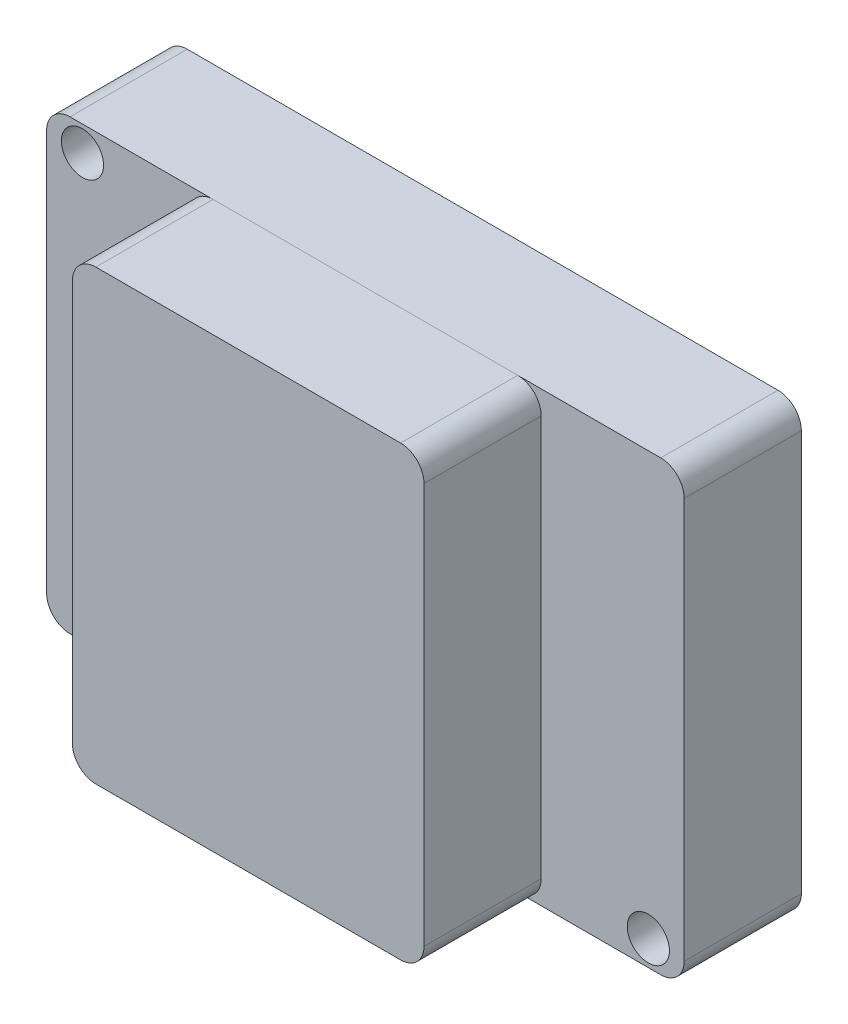
ISO-10303-21;
HEADER;
FILE_DESCRIPTION(('STEP AP214'),'2;1');
FILE_NAME('part.step','',(''),(''),'','','');
FILE_SCHEMA(('AUTOMOTIVE_DESIGN { 1 0 10303 214 1 1 1 1 }'));
ENDSEC;
DATA;
#1=APPLICATION_CONTEXT('core data for automotive mechanical design processes');
#2=APPLICATION_PROTOCOL_DEFINITION('international standard','automotive_design',2000,#1);
#3=PRODUCT_CONTEXT('',#1,'mechanical');
#4=PRODUCT('Part','Part','',(#3));
#5=PRODUCT_RELATED_PRODUCT_CATEGORY('part','',(#4));
#6=PRODUCT_DEFINITION_FORMATION('','',#4);
#7=PRODUCT_DEFINITION_CONTEXT('part definition',#1,'design');
#8=PRODUCT_DEFINITION('design','',#6,#7);
#9=PRODUCT_DEFINITION_SHAPE('','',#8);
#10=(LENGTH_UNIT() NAMED_UNIT(*) SI_UNIT(.MILLI.,.METRE.));
#11=(NAMED_UNIT(*) PLANE_ANGLE_UNIT() SI_UNIT($,.RADIAN.));
#12=(NAMED_UNIT(*) SI_UNIT($,.STERADIAN.) SOLID_ANGLE_UNIT());
#13=UNCERTAINTY_MEASURE_WITH_UNIT(LENGTH_MEASURE(1.E-05),#10,'distance_accuracy_value','');
#14=(GEOMETRIC_REPRESENTATION_CONTEXT(3) GLOBAL_UNCERTAINTY_ASSIGNED_CONTEXT((#13)) GLOBAL_UNIT_ASSIGNED_CONTEXT((#10,
#11,#12)) REPRESENTATION_CONTEXT('',''));
#15=CARTESIAN_POINT('',(0.,0.,0.));
#16=DIRECTION('',(0.,0.,1.));
#17=DIRECTION('',(1.,0.,0.));
#18=AXIS2_PLACEMENT_3D('',#15,#16,#17);
#19=CARTESIAN_POINT('',(19.05,-24.257,25.4));
#20=DIRECTION('',(-1.,0.,0.));
#21=DIRECTION('',(0.,0.,1.));
#22=AXIS2_PLACEMENT_3D('',#19,#20,#21);
#23=PLANE('',#22);
#24=DIRECTION('',(0.,1.,0.));
#25=VECTOR('',#24,1.);
#26=CARTESIAN_POINT('',(19.05,-24.257,12.7));
#27=LINE('',#26,#25);
#28=CARTESIAN_POINT('',(19.05,-21.717,12.7));
#29=VERTEX_POINT('',#28);
#30=CARTESIAN_POINT('',(19.05,21.717,12.7));
#31=VERTEX_POINT('',#30);
#32=EDGE_CURVE('E173',#29,#31,#27,.T.);
#33=ORIENTED_EDGE('',*,*,#32,.T.);
#34=DIRECTION('',(0.,0.,-1.));
#35=VECTOR('',#34,1.);
#36=CARTESIAN_POINT('',(19.05,21.717,25.4));
#37=LINE('',#36,#35);
#38=CARTESIAN_POINT('',(19.05,21.717,25.4));
#39=VERTEX_POINT('',#38);
#40=EDGE_CURVE('E12',#31,#39,#37,.F.);
#41=ORIENTED_EDGE('',*,*,#40,.T.);
#42=DIRECTION('',(0.,1.,0.));
#43=VECTOR('',#42,1.);
#44=CARTESIAN_POINT('',(19.05,-24.257,25.4));
#45=LINE('',#44,#43);
#46=CARTESIAN_POINT('',(19.05,-21.717,25.4));
#47=VERTEX_POINT('',#46);
#48=EDGE_CURVE('E141',#47,#39,#45,.T.);
#49=ORIENTED_EDGE('',*,*,#48,.F.);
#50=DIRECTION('',(0.,0.,-1.));
#51=VECTOR('',#50,1.);
#52=CARTESIAN_POINT('',(19.05,-21.717,25.4));
#53=LINE('',#52,#51);
#54=EDGE_CURVE('E57',#47,#29,#53,.T.);
#55=ORIENTED_EDGE('',*,*,#54,.T.);
#56=EDGE_LOOP('',(#33,#41,#49,#55));
#57=FACE_BOUND('',#56,.T.);
#58=ADVANCED_FACE('F49',(#57),#23,.F.);
#59=CARTESIAN_POINT('',(-19.05,24.257,25.4));
#60=DIRECTION('',(0.,-1.,0.));
#61=DIRECTION('',(0.,0.,-1.));
#62=AXIS2_PLACEMENT_3D('',#59,#60,#61);
#63=PLANE('',#62);
#64=DIRECTION('',(-1.,0.,0.));
#65=VECTOR('',#64,1.);
#66=CARTESIAN_POINT('',(-19.05,24.257,12.7));
#67=LINE('',#66,#65);
#68=CARTESIAN_POINT('',(16.51,24.257,12.7));
#69=VERTEX_POINT('',#68);
#70=CARTESIAN_POINT('',(-16.51,24.257,12.7));
#71=VERTEX_POINT('',#70);
#72=EDGE_CURVE('E146',#69,#71,#67,.T.);
#73=ORIENTED_EDGE('',*,*,#72,.T.);
#74=DIRECTION('',(0.,0.,-1.));
#75=VECTOR('',#74,1.);
#76=CARTESIAN_POINT('',(-16.51,24.257,25.4));
#77=LINE('',#76,#75);
#78=CARTESIAN_POINT('',(-16.51,24.257,25.4));
#79=VERTEX_POINT('',#78);
#80=EDGE_CURVE('E64',#71,#79,#77,.F.);
#81=ORIENTED_EDGE('',*,*,#80,.T.);
#82=DIRECTION('',(-1.,0.,0.));
#83=VECTOR('',#82,1.);
#84=CARTESIAN_POINT('',(-19.05,24.257,25.4));
#85=LINE('',#84,#83);
#86=CARTESIAN_POINT('',(16.51,24.257,25.4));
#87=VERTEX_POINT('',#86);
#88=EDGE_CURVE('E144',#87,#79,#85,.T.);
#89=ORIENTED_EDGE('',*,*,#88,.F.);
#90=DIRECTION('',(0.,0.,-1.));
#91=VECTOR('',#90,1.);
#92=CARTESIAN_POINT('',(16.51,24.257,25.4));
#93=LINE('',#92,#91);
#94=EDGE_CURVE('E165',#87,#69,#93,.T.);
#95=ORIENTED_EDGE('',*,*,#94,.T.);
#96=EDGE_LOOP('',(#73,#81,#89,#95));
#97=FACE_BOUND('',#96,.T.);
#98=ADVANCED_FACE('F193',(#97),#63,.F.);
#99=CARTESIAN_POINT('',(-19.05,-24.257,25.4));
#100=DIRECTION('',(1.,0.,0.));
#101=DIRECTION('',(0.,0.,-1.));
#102=AXIS2_PLACEMENT_3D('',#99,#100,#101);
#103=PLANE('',#102);
#104=DIRECTION('',(0.,-1.,0.));
#105=VECTOR('',#104,1.);
#106=CARTESIAN_POINT('',(-19.05,-24.257,12.7));
#107=LINE('',#106,#105);
#108=CARTESIAN_POINT('',(-19.05,21.717,12.7));
#109=VERTEX_POINT('',#108);
#110=CARTESIAN_POINT('',(-19.05,-21.717,12.7));
#111=VERTEX_POINT('',#110);
#112=EDGE_CURVE('E142',#109,#111,#107,.T.);
#113=ORIENTED_EDGE('',*,*,#112,.T.);
#114=DIRECTION('',(0.,0.,-1.));
#115=VECTOR('',#114,1.);
#116=CARTESIAN_POINT('',(-19.05,-21.717,25.4));
#117=LINE('',#116,#115);
#118=CARTESIAN_POINT('',(-19.05,-21.717,25.4));
#119=VERTEX_POINT('',#118);
#120=EDGE_CURVE('E120',#111,#119,#117,.F.);
#121=ORIENTED_EDGE('',*,*,#120,.T.);
#122=DIRECTION('',(0.,-1.,0.));
#123=VECTOR('',#122,1.);
#124=CARTESIAN_POINT('',(-19.05,-24.257,25.4));
#125=LINE('',#124,#123);
#126=CARTESIAN_POINT('',(-19.05,21.717,25.4));
#127=VERTEX_POINT('',#126);
#128=EDGE_CURVE('E181',#127,#119,#125,.T.);
#129=ORIENTED_EDGE('',*,*,#128,.F.);
#130=DIRECTION('',(0.,0.,-1.));
#131=VECTOR('',#130,1.);
#132=CARTESIAN_POINT('',(-19.05,21.717,25.4));
#133=LINE('',#132,#131);
#134=EDGE_CURVE('E125',#127,#109,#133,.T.);
#135=ORIENTED_EDGE('',*,*,#134,.T.);
#136=EDGE_LOOP('',(#113,#121,#129,#135));
#137=FACE_BOUND('',#136,.T.);
#138=ADVANCED_FACE('F192',(#137),#103,.F.);
#139=CARTESIAN_POINT('',(-19.05,-24.257,25.4));
#140=DIRECTION('',(0.,1.,0.));
#141=DIRECTION('',(0.,0.,1.));
#142=AXIS2_PLACEMENT_3D('',#139,#140,#141);
#143=PLANE('',#142);
#144=DIRECTION('',(1.,0.,0.));
#145=VECTOR('',#144,1.);
#146=CARTESIAN_POINT('',(-19.05,-24.257,25.4));
#147=LINE('',#146,#145);
#148=CARTESIAN_POINT('',(-16.51,-24.257,25.4));
#149=VERTEX_POINT('',#148);
#150=CARTESIAN_POINT('',(16.51,-24.257,25.4));
#151=VERTEX_POINT('',#150);
#152=EDGE_CURVE('E135',#149,#151,#147,.T.);
#153=ORIENTED_EDGE('',*,*,#152,.F.);
#154=DIRECTION('',(0.,0.,-1.));
#155=VECTOR('',#154,1.);
#156=CARTESIAN_POINT('',(-16.51,-24.257,25.4));
#157=LINE('',#156,#155);
#158=CARTESIAN_POINT('',(-16.51,-24.257,12.7));
#159=VERTEX_POINT('',#158);
#160=EDGE_CURVE('E119',#149,#159,#157,.T.);
#161=ORIENTED_EDGE('',*,*,#160,.T.);
#162=DIRECTION('',(1.,0.,0.));
#163=VECTOR('',#162,1.);
#164=CARTESIAN_POINT('',(-19.05,-24.257,12.7));
#165=LINE('',#164,#163);
#166=CARTESIAN_POINT('',(16.51,-24.257,12.7));
#167=VERTEX_POINT('',#166);
#168=EDGE_CURVE('E132',#159,#167,#165,.T.);
#169=ORIENTED_EDGE('',*,*,#168,.T.);
#170=DIRECTION('',(0.,0.,-1.));
#171=VECTOR('',#170,1.);
#172=CARTESIAN_POINT('',(16.51,-24.257,25.4));
#173=LINE('',#172,#171);
#174=EDGE_CURVE('E137',#167,#151,#173,.F.);
#175=ORIENTED_EDGE('',*,*,#174,.T.);
#176=EDGE_LOOP('',(#153,#161,#169,#175));
#177=FACE_BOUND('',#176,.T.);
#178=ADVANCED_FACE('F131',(#177),#143,.F.);
#179=CARTESIAN_POINT('',(0.,0.,25.4));
#180=DIRECTION('',(0.,0.,-1.));
#181=DIRECTION('',(-1.,0.,0.));
#182=AXIS2_PLACEMENT_3D('',#179,#180,#181);
#183=PLANE('',#182);
#184=ORIENTED_EDGE('',*,*,#128,.T.);
#185=CARTESIAN_POINT('',(-16.51,-21.717,25.4));
#186=DIRECTION('',(0.,0.,-1.));
#187=DIRECTION('',(-1.,0.,0.));
#188=AXIS2_PLACEMENT_3D('',#185,#186,#187);
#189=CIRCLE('',#188,2.54);
#190=EDGE_CURVE('E163',#119,#149,#189,.F.);
#191=ORIENTED_EDGE('',*,*,#190,.T.);
#192=ORIENTED_EDGE('',*,*,#152,.T.);
#193=CARTESIAN_POINT('',(16.51,-21.717,25.4));
#194=DIRECTION('',(0.,0.,-1.));
#195=DIRECTION('',(-1.,0.,0.));
#196=AXIS2_PLACEMENT_3D('',#193,#194,#195);
#197=CIRCLE('',#196,2.54);
#198=EDGE_CURVE('E158',#151,#47,#197,.F.);
#199=ORIENTED_EDGE('',*,*,#198,.T.);
#200=ORIENTED_EDGE('',*,*,#48,.T.);
#201=CARTESIAN_POINT('',(16.51,21.717,25.4));
#202=DIRECTION('',(0.,0.,-1.));
#203=DIRECTION('',(-1.,0.,0.));
#204=AXIS2_PLACEMENT_3D('',#201,#202,#203);
#205=CIRCLE('',#204,2.54);
#206=EDGE_CURVE('E71',#39,#87,#205,.F.);
#207=ORIENTED_EDGE('',*,*,#206,.T.);
#208=ORIENTED_EDGE('',*,*,#88,.T.);
#209=CARTESIAN_POINT('',(-16.51,21.717,25.4));
#210=DIRECTION('',(0.,0.,-1.));
#211=DIRECTION('',(-1.,0.,0.));
#212=AXIS2_PLACEMENT_3D('',#209,#210,#211);
#213=CIRCLE('',#212,2.54);
#214=EDGE_CURVE('E161',#79,#127,#213,.F.);
#215=ORIENTED_EDGE('',*,*,#214,.T.);
#216=EDGE_LOOP('',(#184,#191,#192,#199,#200,#207,#208,#215));
#217=FACE_BOUND('',#216,.T.);
#218=ADVANCED_FACE('F185',(#217),#183,.F.);
#219=CARTESIAN_POINT('',(0.,0.,12.7));
#220=DIRECTION('',(0.,0.,-1.));
#221=DIRECTION('',(-1.,0.,0.));
#222=AXIS2_PLACEMENT_3D('',#219,#220,#221);
#223=PLANE('',#222);
#224=ORIENTED_EDGE('',*,*,#168,.F.);
#225=CARTESIAN_POINT('',(-16.51,-21.717,12.7));
#226=DIRECTION('',(0.,0.,-1.));
#227=DIRECTION('',(-1.,0.,0.));
#228=AXIS2_PLACEMENT_3D('',#225,#226,#227);
#229=CIRCLE('',#228,2.54);
#230=EDGE_CURVE('E115',#159,#111,#229,.T.);
#231=ORIENTED_EDGE('',*,*,#230,.T.);
#232=ORIENTED_EDGE('',*,*,#112,.F.);
#233=CARTESIAN_POINT('',(-16.51,21.717,12.7));
#234=DIRECTION('',(0.,0.,-1.));
#235=DIRECTION('',(-1.,0.,0.));
#236=AXIS2_PLACEMENT_3D('',#233,#234,#235);
#237=CIRCLE('',#236,2.54);
#238=EDGE_CURVE('E126',#109,#71,#237,.T.);
#239=ORIENTED_EDGE('',*,*,#238,.T.);
#240=ORIENTED_EDGE('',*,*,#72,.F.);
#241=CARTESIAN_POINT('',(16.51,21.717,12.7));
#242=DIRECTION('',(0.,0.,-1.));
#243=DIRECTION('',(-1.,0.,0.));
#244=AXIS2_PLACEMENT_3D('',#241,#242,#243);
#245=CIRCLE('',#244,2.54);
#246=EDGE_CURVE('E152',#69,#31,#245,.T.);
#247=ORIENTED_EDGE('',*,*,#246,.T.);
#248=ORIENTED_EDGE('',*,*,#32,.F.);
#249=CARTESIAN_POINT('',(16.51,-21.717,12.7));
#250=DIRECTION('',(0.,0.,-1.));
#251=DIRECTION('',(-1.,0.,0.));
#252=AXIS2_PLACEMENT_3D('',#249,#250,#251);
#253=CIRCLE('',#252,2.54);
#254=EDGE_CURVE('E136',#29,#167,#253,.T.);
#255=ORIENTED_EDGE('',*,*,#254,.T.);
#256=EDGE_LOOP('',(#224,#231,#232,#239,#240,#247,#248,#255));
#257=FACE_BOUND('',#256,.T.);
#258=ADVANCED_FACE('F139',(#257),#223,.T.);
#259=CARTESIAN_POINT('',(-16.51,-21.717,25.4));
#260=DIRECTION('',(0.,0.,-1.));
#261=DIRECTION('',(-1.,0.,0.));
#262=AXIS2_PLACEMENT_3D('',#259,#260,#261);
#263=CYLINDRICAL_SURFACE('',#262,2.54);
#264=ORIENTED_EDGE('',*,*,#190,.F.);
#265=ORIENTED_EDGE('',*,*,#120,.F.);
#266=ORIENTED_EDGE('',*,*,#230,.F.);
#267=ORIENTED_EDGE('',*,*,#160,.F.);
#268=EDGE_LOOP('',(#264,#265,#266,#267));
#269=FACE_BOUND('',#268,.T.);
#270=ADVANCED_FACE('F118',(#269),#263,.T.);
#271=CARTESIAN_POINT('',(-16.51,21.717,25.4));
#272=DIRECTION('',(0.,0.,-1.));
#273=DIRECTION('',(-1.,0.,0.));
#274=AXIS2_PLACEMENT_3D('',#271,#272,#273);
#275=CYLINDRICAL_SURFACE('',#274,2.54);
#276=ORIENTED_EDGE('',*,*,#214,.F.);
#277=ORIENTED_EDGE('',*,*,#80,.F.);
#278=ORIENTED_EDGE('',*,*,#238,.F.);
#279=ORIENTED_EDGE('',*,*,#134,.F.);
#280=EDGE_LOOP('',(#276,#277,#278,#279));
#281=FACE_BOUND('',#280,.T.);
#282=ADVANCED_FACE('F190',(#281),#275,.T.);
#283=CARTESIAN_POINT('',(16.51,21.717,25.4));
#284=DIRECTION('',(0.,0.,-1.));
#285=DIRECTION('',(-1.,0.,0.));
#286=AXIS2_PLACEMENT_3D('',#283,#284,#285);
#287=CYLINDRICAL_SURFACE('',#286,2.54);
#288=ORIENTED_EDGE('',*,*,#206,.F.);
#289=ORIENTED_EDGE('',*,*,#40,.F.);
#290=ORIENTED_EDGE('',*,*,#246,.F.);
#291=ORIENTED_EDGE('',*,*,#94,.F.);
#292=EDGE_LOOP('',(#288,#289,#290,#291));
#293=FACE_BOUND('',#292,.T.);
#294=ADVANCED_FACE('F195',(#293),#287,.T.);
#295=CARTESIAN_POINT('',(16.51,-21.717,25.4));
#296=DIRECTION('',(0.,0.,-1.));
#297=DIRECTION('',(-1.,0.,0.));
#298=AXIS2_PLACEMENT_3D('',#295,#296,#297);
#299=CYLINDRICAL_SURFACE('',#298,2.54);
#300=ORIENTED_EDGE('',*,*,#198,.F.);
#301=ORIENTED_EDGE('',*,*,#174,.F.);
#302=ORIENTED_EDGE('',*,*,#254,.F.);
#303=ORIENTED_EDGE('',*,*,#54,.F.);
#304=EDGE_LOOP('',(#300,#301,#302,#303));
#305=FACE_BOUND('',#304,.T.);
#306=ADVANCED_FACE('F51',(#305),#299,.T.);
#307=CLOSED_SHELL('',(#58,#98,#138,#178,#218,#258,#270,#282,#294,#306));
#308=MANIFOLD_SOLID_BREP('B2',#307);
#309=CARTESIAN_POINT('',(0.,0.,12.7));
#310=DIRECTION('',(0.,0.,-1.));
#311=DIRECTION('',(-1.,0.,0.));
#312=AXIS2_PLACEMENT_3D('',#309,#310,#311);
#313=PLANE('',#312);
#314=DIRECTION('',(-1.,0.,0.));
#315=VECTOR('',#314,1.);
#316=CARTESIAN_POINT('',(-34.544,24.257,12.7));
#317=LINE('',#316,#315);
#318=CARTESIAN_POINT('',(32.004,24.257,12.7));
#319=VERTEX_POINT('',#318);
#320=CARTESIAN_POINT('',(-32.004,24.257,12.7));
#321=VERTEX_POINT('',#320);
#322=EDGE_CURVE('E433',#319,#321,#317,.T.);
#323=ORIENTED_EDGE('',*,*,#322,.T.);
#324=CARTESIAN_POINT('',(-32.004,21.717,12.7));
#325=DIRECTION('',(0.,0.,-1.));
#326=DIRECTION('',(-1.,0.,0.));
#327=AXIS2_PLACEMENT_3D('',#324,#325,#326);
#328=CIRCLE('',#327,2.54);
#329=CARTESIAN_POINT('',(-34.544,21.717,12.7));
#330=VERTEX_POINT('',#329);
#331=EDGE_CURVE('E406',#321,#330,#328,.F.);
#332=ORIENTED_EDGE('',*,*,#331,.T.);
#333=DIRECTION('',(0.,-1.,0.));
#334=VECTOR('',#333,1.);
#335=CARTESIAN_POINT('',(-34.544,-24.257,12.7));
#336=LINE('',#335,#334);
#337=CARTESIAN_POINT('',(-34.544,-21.717,12.7));
#338=VERTEX_POINT('',#337);
#339=EDGE_CURVE('E363',#330,#338,#336,.T.);
#340=ORIENTED_EDGE('',*,*,#339,.T.);
#341=CARTESIAN_POINT('',(-32.004,-21.717,12.7));
#342=DIRECTION('',(0.,0.,-1.));
#343=DIRECTION('',(-1.,0.,0.));
#344=AXIS2_PLACEMENT_3D('',#341,#342,#343);
#345=CIRCLE('',#344,2.54);
#346=CARTESIAN_POINT('',(-32.004,-24.257,12.7));
#347=VERTEX_POINT('',#346);
#348=EDGE_CURVE('E298',#338,#347,#345,.F.);
#349=ORIENTED_EDGE('',*,*,#348,.T.);
#350=DIRECTION('',(1.,0.,0.));
#351=VECTOR('',#350,1.);
#352=CARTESIAN_POINT('',(-34.544,-24.257,12.7));
#353=LINE('',#352,#351);
#354=CARTESIAN_POINT('',(32.004,-24.257,12.7));
#355=VERTEX_POINT('',#354);
#356=EDGE_CURVE('E384',#347,#355,#353,.T.);
#357=ORIENTED_EDGE('',*,*,#356,.T.);
#358=CARTESIAN_POINT('',(32.004,-21.717,12.7));
#359=DIRECTION('',(0.,0.,-1.));
#360=DIRECTION('',(-1.,0.,0.));
#361=AXIS2_PLACEMENT_3D('',#358,#359,#360);
#362=CIRCLE('',#361,2.54);
#363=CARTESIAN_POINT('',(34.544,-21.717,12.7));
#364=VERTEX_POINT('',#363);
#365=EDGE_CURVE('E400',#355,#364,#362,.F.);
#366=ORIENTED_EDGE('',*,*,#365,.T.);
#367=DIRECTION('',(0.,1.,0.));
#368=VECTOR('',#367,1.);
#369=CARTESIAN_POINT('',(34.544,-24.257,12.7));
#370=LINE('',#369,#368);
#371=CARTESIAN_POINT('',(34.544,21.717,12.7));
#372=VERTEX_POINT('',#371);
#373=EDGE_CURVE('E377',#364,#372,#370,.T.);
#374=ORIENTED_EDGE('',*,*,#373,.T.);
#375=CARTESIAN_POINT('',(32.004,21.717,12.7));
#376=DIRECTION('',(0.,0.,-1.));
#377=DIRECTION('',(-1.,0.,0.));
#378=AXIS2_PLACEMENT_3D('',#375,#376,#377);
#379=CIRCLE('',#378,2.54);
#380=EDGE_CURVE('E403',#372,#319,#379,.F.);
#381=ORIENTED_EDGE('',*,*,#380,.T.);
#382=EDGE_LOOP('',(#323,#332,#340,#349,#357,#366,#374,#381));
#383=FACE_BOUND('',#382,.T.);
#384=CARTESIAN_POINT('',(-30.6607160060067,21.5301351365709,12.7));
#385=DIRECTION('',(0.,0.,1.));
#386=DIRECTION('',(1.,0.,0.));
#387=AXIS2_PLACEMENT_3D('',#384,#385,#386);
#388=CIRCLE('',#387,2.286);
#389=CARTESIAN_POINT('',(-28.3747160060067,21.5301351365709,12.7));
#390=VERTEX_POINT('',#389);
#391=EDGE_CURVE('E446',#390,#390,#388,.T.);
#392=ORIENTED_EDGE('',*,*,#391,.F.);
#393=EDGE_LOOP('',(#392));
#394=FACE_BOUND('',#393,.T.);
#395=CARTESIAN_POINT('',(30.6607160060067,-21.5301351365709,12.7));
#396=DIRECTION('',(0.,0.,1.));
#397=DIRECTION('',(1.,0.,0.));
#398=AXIS2_PLACEMENT_3D('',#395,#396,#397);
#399=CIRCLE('',#398,2.286);
#400=CARTESIAN_POINT('',(32.9467160060067,-21.5301351365709,12.7));
#401=VERTEX_POINT('',#400);
#402=EDGE_CURVE('E453',#401,#401,#399,.T.);
#403=ORIENTED_EDGE('',*,*,#402,.F.);
#404=EDGE_LOOP('',(#403));
#405=FACE_BOUND('',#404,.T.);
#406=ADVANCED_FACE('F277',(#383,#394,#405),#313,.F.);
#407=CARTESIAN_POINT('',(0.,0.,0.));
#408=DIRECTION('',(0.,0.,-1.));
#409=DIRECTION('',(-1.,0.,0.));
#410=AXIS2_PLACEMENT_3D('',#407,#408,#409);
#411=PLANE('',#410);
#412=CARTESIAN_POINT('',(-30.6607160060067,21.5301351365709,0.));
#413=DIRECTION('',(0.,0.,1.));
#414=DIRECTION('',(1.,0.,0.));
#415=AXIS2_PLACEMENT_3D('',#412,#413,#414);
#416=CIRCLE('',#415,2.286);
#417=CARTESIAN_POINT('',(-28.3747160060067,21.5301351365709,0.));
#418=VERTEX_POINT('',#417);
#419=EDGE_CURVE('E439',#418,#418,#416,.T.);
#420=ORIENTED_EDGE('',*,*,#419,.T.);
#421=EDGE_LOOP('',(#420));
#422=FACE_BOUND('',#421,.T.);
#423=DIRECTION('',(0.,-1.,0.));
#424=VECTOR('',#423,1.);
#425=CARTESIAN_POINT('',(-34.544,-24.257,0.));
#426=LINE('',#425,#424);
#427=CARTESIAN_POINT('',(-34.544,21.717,0.));
#428=VERTEX_POINT('',#427);
#429=CARTESIAN_POINT('',(-34.544,-21.717,0.));
#430=VERTEX_POINT('',#429);
#431=EDGE_CURVE('E361',#428,#430,#426,.T.);
#432=ORIENTED_EDGE('',*,*,#431,.F.);
#433=CARTESIAN_POINT('',(-32.004,21.717,0.));
#434=DIRECTION('',(0.,0.,-1.));
#435=DIRECTION('',(-1.,0.,0.));
#436=AXIS2_PLACEMENT_3D('',#433,#434,#435);
#437=CIRCLE('',#436,2.54);
#438=CARTESIAN_POINT('',(-32.004,24.257,0.));
#439=VERTEX_POINT('',#438);
#440=EDGE_CURVE('E343',#428,#439,#437,.T.);
#441=ORIENTED_EDGE('',*,*,#440,.T.);
#442=DIRECTION('',(-1.,0.,0.));
#443=VECTOR('',#442,1.);
#444=CARTESIAN_POINT('',(-34.544,24.257,0.));
#445=LINE('',#444,#443);
#446=CARTESIAN_POINT('',(32.004,24.257,0.));
#447=VERTEX_POINT('',#446);
#448=EDGE_CURVE('E373',#447,#439,#445,.T.);
#449=ORIENTED_EDGE('',*,*,#448,.F.);
#450=CARTESIAN_POINT('',(32.004,21.717,0.));
#451=DIRECTION('',(0.,0.,-1.));
#452=DIRECTION('',(-1.,0.,0.));
#453=AXIS2_PLACEMENT_3D('',#450,#451,#452);
#454=CIRCLE('',#453,2.54);
#455=CARTESIAN_POINT('',(34.544,21.717,0.));
#456=VERTEX_POINT('',#455);
#457=EDGE_CURVE('E355',#447,#456,#454,.T.);
#458=ORIENTED_EDGE('',*,*,#457,.T.);
#459=DIRECTION('',(0.,1.,0.));
#460=VECTOR('',#459,1.);
#461=CARTESIAN_POINT('',(34.544,-24.257,0.));
#462=LINE('',#461,#460);
#463=CARTESIAN_POINT('',(34.544,-21.717,0.));
#464=VERTEX_POINT('',#463);
#465=EDGE_CURVE('E379',#464,#456,#462,.T.);
#466=ORIENTED_EDGE('',*,*,#465,.F.);
#467=CARTESIAN_POINT('',(32.004,-21.717,0.));
#468=DIRECTION('',(0.,0.,-1.));
#469=DIRECTION('',(-1.,0.,0.));
#470=AXIS2_PLACEMENT_3D('',#467,#468,#469);
#471=CIRCLE('',#470,2.54);
#472=CARTESIAN_POINT('',(32.004,-24.257,0.));
#473=VERTEX_POINT('',#472);
#474=EDGE_CURVE('E388',#464,#473,#471,.T.);
#475=ORIENTED_EDGE('',*,*,#474,.T.);
#476=DIRECTION('',(1.,0.,0.));
#477=VECTOR('',#476,1.);
#478=CARTESIAN_POINT('',(-34.544,-24.257,0.));
#479=LINE('',#478,#477);
#480=CARTESIAN_POINT('',(-32.004,-24.257,0.));
#481=VERTEX_POINT('',#480);
#482=EDGE_CURVE('E372',#481,#473,#479,.T.);
#483=ORIENTED_EDGE('',*,*,#482,.F.);
#484=CARTESIAN_POINT('',(-32.004,-21.717,0.));
#485=DIRECTION('',(0.,0.,-1.));
#486=DIRECTION('',(-1.,0.,0.));
#487=AXIS2_PLACEMENT_3D('',#484,#485,#486);
#488=CIRCLE('',#487,2.54);
#489=EDGE_CURVE('E365',#481,#430,#488,.T.);
#490=ORIENTED_EDGE('',*,*,#489,.T.);
#491=EDGE_LOOP('',(#432,#441,#449,#458,#466,#475,#483,#490));
#492=FACE_BOUND('',#491,.T.);
#493=CARTESIAN_POINT('',(30.6607160060067,-21.5301351365709,0.));
#494=DIRECTION('',(0.,0.,1.));
#495=DIRECTION('',(1.,0.,0.));
#496=AXIS2_PLACEMENT_3D('',#493,#494,#495);
#497=CIRCLE('',#496,2.286);
#498=CARTESIAN_POINT('',(32.9467160060067,-21.5301351365709,0.));
#499=VERTEX_POINT('',#498);
#500=EDGE_CURVE('E455',#499,#499,#497,.T.);
#501=ORIENTED_EDGE('',*,*,#500,.T.);
#502=EDGE_LOOP('',(#501));
#503=FACE_BOUND('',#502,.T.);
#504=ADVANCED_FACE('F368',(#422,#492,#503),#411,.T.);
#505=CARTESIAN_POINT('',(34.544,-24.257,12.7));
#506=DIRECTION('',(-1.,0.,0.));
#507=DIRECTION('',(0.,0.,1.));
#508=AXIS2_PLACEMENT_3D('',#505,#506,#507);
#509=PLANE('',#508);
#510=ORIENTED_EDGE('',*,*,#465,.T.);
#511=DIRECTION('',(0.,0.,-1.));
#512=VECTOR('',#511,1.);
#513=CARTESIAN_POINT('',(34.544,21.717,12.7));
#514=LINE('',#513,#512);
#515=EDGE_CURVE('E413',#456,#372,#514,.F.);
#516=ORIENTED_EDGE('',*,*,#515,.T.);
#517=ORIENTED_EDGE('',*,*,#373,.F.);
#518=DIRECTION('',(0.,0.,-1.));
#519=VECTOR('',#518,1.);
#520=CARTESIAN_POINT('',(34.544,-21.717,12.7));
#521=LINE('',#520,#519);
#522=EDGE_CURVE('E409',#364,#464,#521,.T.);
#523=ORIENTED_EDGE('',*,*,#522,.T.);
#524=EDGE_LOOP('',(#510,#516,#517,#523));
#525=FACE_BOUND('',#524,.T.);
#526=ADVANCED_FACE('F428',(#525),#509,.F.);
#527=CARTESIAN_POINT('',(-34.544,24.257,12.7));
#528=DIRECTION('',(0.,-1.,0.));
#529=DIRECTION('',(0.,0.,-1.));
#530=AXIS2_PLACEMENT_3D('',#527,#528,#529);
#531=PLANE('',#530);
#532=ORIENTED_EDGE('',*,*,#448,.T.);
#533=DIRECTION('',(0.,0.,-1.));
#534=VECTOR('',#533,1.);
#535=CARTESIAN_POINT('',(-32.004,24.257,12.7));
#536=LINE('',#535,#534);
#537=EDGE_CURVE('E348',#439,#321,#536,.F.);
#538=ORIENTED_EDGE('',*,*,#537,.T.);
#539=ORIENTED_EDGE('',*,*,#322,.F.);
#540=DIRECTION('',(0.,0.,-1.));
#541=VECTOR('',#540,1.);
#542=CARTESIAN_POINT('',(32.004,24.257,12.7));
#543=LINE('',#542,#541);
#544=EDGE_CURVE('E354',#319,#447,#543,.T.);
#545=ORIENTED_EDGE('',*,*,#544,.T.);
#546=EDGE_LOOP('',(#532,#538,#539,#545));
#547=FACE_BOUND('',#546,.T.);
#548=ADVANCED_FACE('F482',(#547),#531,.F.);
#549=CARTESIAN_POINT('',(-34.544,-24.257,12.7));
#550=DIRECTION('',(1.,0.,0.));
#551=DIRECTION('',(0.,0.,-1.));
#552=AXIS2_PLACEMENT_3D('',#549,#550,#551);
#553=PLANE('',#552);
#554=ORIENTED_EDGE('',*,*,#339,.F.);
#555=DIRECTION('',(0.,0.,-1.));
#556=VECTOR('',#555,1.);
#557=CARTESIAN_POINT('',(-34.544,21.717,12.7));
#558=LINE('',#557,#556);
#559=EDGE_CURVE('E347',#330,#428,#558,.T.);
#560=ORIENTED_EDGE('',*,*,#559,.T.);
#561=ORIENTED_EDGE('',*,*,#431,.T.);
#562=DIRECTION('',(0.,0.,-1.));
#563=VECTOR('',#562,1.);
#564=CARTESIAN_POINT('',(-34.544,-21.717,12.7));
#565=LINE('',#564,#563);
#566=EDGE_CURVE('E366',#430,#338,#565,.F.);
#567=ORIENTED_EDGE('',*,*,#566,.T.);
#568=EDGE_LOOP('',(#554,#560,#561,#567));
#569=FACE_BOUND('',#568,.T.);
#570=ADVANCED_FACE('F360',(#569),#553,.F.);
#571=CARTESIAN_POINT('',(-34.544,-24.257,12.7));
#572=DIRECTION('',(0.,1.,0.));
#573=DIRECTION('',(0.,0.,1.));
#574=AXIS2_PLACEMENT_3D('',#571,#572,#573);
#575=PLANE('',#574);
#576=ORIENTED_EDGE('',*,*,#482,.T.);
#577=DIRECTION('',(0.,0.,-1.));
#578=VECTOR('',#577,1.);
#579=CARTESIAN_POINT('',(32.004,-24.257,12.7));
#580=LINE('',#579,#578);
#581=EDGE_CURVE('E47',#473,#355,#580,.F.);
#582=ORIENTED_EDGE('',*,*,#581,.T.);
#583=ORIENTED_EDGE('',*,*,#356,.F.);
#584=DIRECTION('',(0.,0.,-1.));
#585=VECTOR('',#584,1.);
#586=CARTESIAN_POINT('',(-32.004,-24.257,12.7));
#587=LINE('',#586,#585);
#588=EDGE_CURVE('E286',#347,#481,#587,.T.);
#589=ORIENTED_EDGE('',*,*,#588,.T.);
#590=EDGE_LOOP('',(#576,#582,#583,#589));
#591=FACE_BOUND('',#590,.T.);
#592=ADVANCED_FACE('F418',(#591),#575,.F.);
#593=CARTESIAN_POINT('',(-30.6607160060067,21.5301351365709,12.7));
#594=DIRECTION('',(0.,0.,-1.));
#595=DIRECTION('',(-1.,0.,0.));
#596=AXIS2_PLACEMENT_3D('',#593,#594,#595);
#597=CYLINDRICAL_SURFACE('',#596,2.286);
#598=ORIENTED_EDGE('',*,*,#391,.T.);
#599=EDGE_LOOP('',(#598));
#600=FACE_BOUND('',#599,.T.);
#601=ORIENTED_EDGE('',*,*,#419,.F.);
#602=EDGE_LOOP('',(#601));
#603=FACE_BOUND('',#602,.T.);
#604=ADVANCED_FACE('F475',(#600,#603),#597,.F.);
#605=CARTESIAN_POINT('',(30.6607160060067,-21.5301351365709,12.7));
#606=DIRECTION('',(0.,0.,-1.));
#607=DIRECTION('',(-1.,0.,0.));
#608=AXIS2_PLACEMENT_3D('',#605,#606,#607);
#609=CYLINDRICAL_SURFACE('',#608,2.286);
#610=ORIENTED_EDGE('',*,*,#402,.T.);
#611=EDGE_LOOP('',(#610));
#612=FACE_BOUND('',#611,.T.);
#613=ORIENTED_EDGE('',*,*,#500,.F.);
#614=EDGE_LOOP('',(#613));
#615=FACE_BOUND('',#614,.T.);
#616=ADVANCED_FACE('F463',(#612,#615),#609,.F.);
#617=CARTESIAN_POINT('',(-32.004,21.717,12.7));
#618=DIRECTION('',(0.,0.,-1.));
#619=DIRECTION('',(-1.,0.,0.));
#620=AXIS2_PLACEMENT_3D('',#617,#618,#619);
#621=CYLINDRICAL_SURFACE('',#620,2.54);
#622=ORIENTED_EDGE('',*,*,#331,.F.);
#623=ORIENTED_EDGE('',*,*,#537,.F.);
#624=ORIENTED_EDGE('',*,*,#440,.F.);
#625=ORIENTED_EDGE('',*,*,#559,.F.);
#626=EDGE_LOOP('',(#622,#623,#624,#625));
#627=FACE_BOUND('',#626,.T.);
#628=ADVANCED_FACE('F346',(#627),#621,.T.);
#629=CARTESIAN_POINT('',(32.004,21.717,12.7));
#630=DIRECTION('',(0.,0.,-1.));
#631=DIRECTION('',(-1.,0.,0.));
#632=AXIS2_PLACEMENT_3D('',#629,#630,#631);
#633=CYLINDRICAL_SURFACE('',#632,2.54);
#634=ORIENTED_EDGE('',*,*,#380,.F.);
#635=ORIENTED_EDGE('',*,*,#515,.F.);
#636=ORIENTED_EDGE('',*,*,#457,.F.);
#637=ORIENTED_EDGE('',*,*,#544,.F.);
#638=EDGE_LOOP('',(#634,#635,#636,#637));
#639=FACE_BOUND('',#638,.T.);
#640=ADVANCED_FACE('F490',(#639),#633,.T.);
#641=CARTESIAN_POINT('',(32.004,-21.717,12.7));
#642=DIRECTION('',(0.,0.,-1.));
#643=DIRECTION('',(-1.,0.,0.));
#644=AXIS2_PLACEMENT_3D('',#641,#642,#643);
#645=CYLINDRICAL_SURFACE('',#644,2.54);
#646=ORIENTED_EDGE('',*,*,#365,.F.);
#647=ORIENTED_EDGE('',*,*,#581,.F.);
#648=ORIENTED_EDGE('',*,*,#474,.F.);
#649=ORIENTED_EDGE('',*,*,#522,.F.);
#650=EDGE_LOOP('',(#646,#647,#648,#649));
#651=FACE_BOUND('',#650,.T.);
#652=ADVANCED_FACE('F425',(#651),#645,.T.);
#653=CARTESIAN_POINT('',(-32.004,-21.717,12.7));
#654=DIRECTION('',(0.,0.,-1.));
#655=DIRECTION('',(-1.,0.,0.));
#656=AXIS2_PLACEMENT_3D('',#653,#654,#655);
#657=CYLINDRICAL_SURFACE('',#656,2.54);
#658=ORIENTED_EDGE('',*,*,#348,.F.);
#659=ORIENTED_EDGE('',*,*,#566,.F.);
#660=ORIENTED_EDGE('',*,*,#489,.F.);
#661=ORIENTED_EDGE('',*,*,#588,.F.);
#662=EDGE_LOOP('',(#658,#659,#660,#661));
#663=FACE_BOUND('',#662,.T.);
#664=ADVANCED_FACE('F279',(#663),#657,.T.);
#665=CLOSED_SHELL('',(#406,#504,#526,#548,#570,#592,#604,#616,#628,#640,#652,#664));
#666=MANIFOLD_SOLID_BREP('B6',#665);
#667=ADVANCED_BREP_SHAPE_REPRESENTATION('',(#18,#308,#666),#14);
#668=SHAPE_DEFINITION_REPRESENTATION(#9,#667);
ENDSEC;
END-ISO-10303-21;
